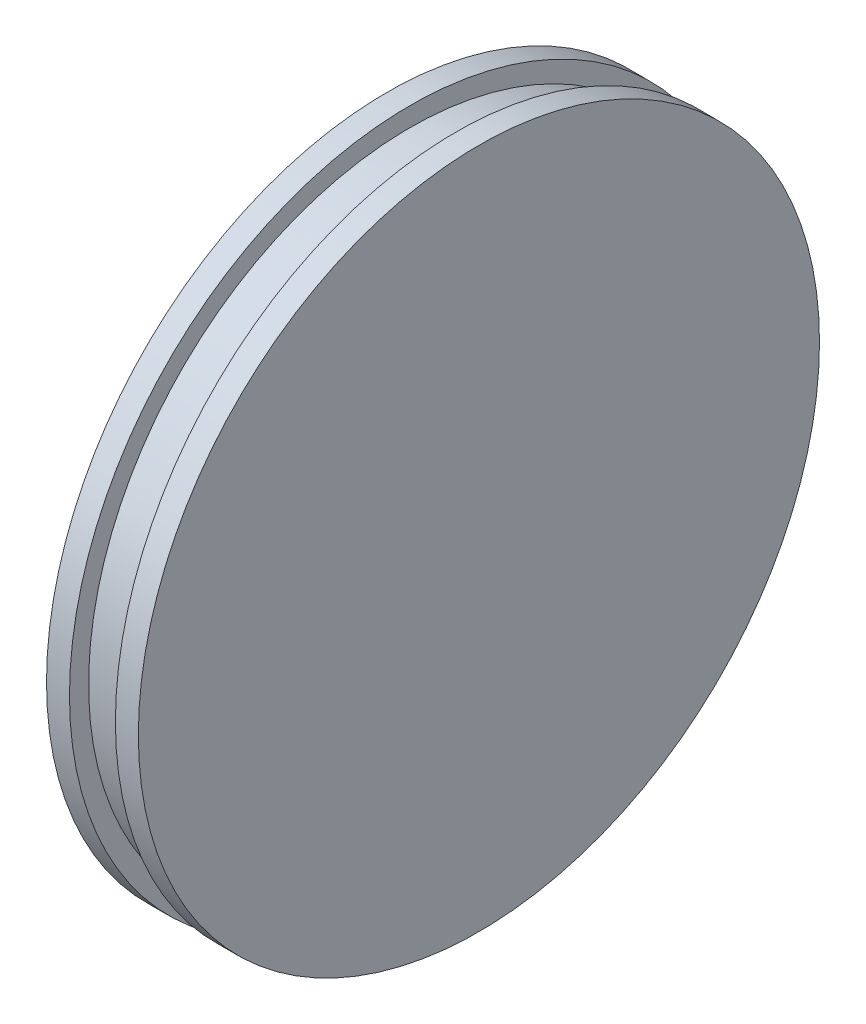
ISO-10303-21;
HEADER;
FILE_DESCRIPTION(('STEP AP214'),'2;1');
FILE_NAME('part.step','',(''),(''),'','','');
FILE_SCHEMA(('AUTOMOTIVE_DESIGN { 1 0 10303 214 1 1 1 1 }'));
ENDSEC;
DATA;
#1=APPLICATION_CONTEXT('core data for automotive mechanical design processes');
#2=APPLICATION_PROTOCOL_DEFINITION('international standard','automotive_design',2000,#1);
#3=PRODUCT_CONTEXT('',#1,'mechanical');
#4=PRODUCT('Part','Part','',(#3));
#5=PRODUCT_RELATED_PRODUCT_CATEGORY('part','',(#4));
#6=PRODUCT_DEFINITION_FORMATION('','',#4);
#7=PRODUCT_DEFINITION_CONTEXT('part definition',#1,'design');
#8=PRODUCT_DEFINITION('design','',#6,#7);
#9=PRODUCT_DEFINITION_SHAPE('','',#8);
#10=(LENGTH_UNIT() NAMED_UNIT(*) SI_UNIT(.MILLI.,.METRE.));
#11=(NAMED_UNIT(*) PLANE_ANGLE_UNIT() SI_UNIT($,.RADIAN.));
#12=(NAMED_UNIT(*) SI_UNIT($,.STERADIAN.) SOLID_ANGLE_UNIT());
#13=UNCERTAINTY_MEASURE_WITH_UNIT(LENGTH_MEASURE(1.E-05),#10,'distance_accuracy_value','');
#14=(GEOMETRIC_REPRESENTATION_CONTEXT(3) GLOBAL_UNCERTAINTY_ASSIGNED_CONTEXT((#13)) GLOBAL_UNIT_ASSIGNED_CONTEXT((#10,
#11,#12)) REPRESENTATION_CONTEXT('',''));
#15=CARTESIAN_POINT('',(0.,0.,0.));
#16=DIRECTION('',(0.,0.,1.));
#17=DIRECTION('',(1.,0.,0.));
#18=AXIS2_PLACEMENT_3D('',#15,#16,#17);
#19=CARTESIAN_POINT('',(12.,0.,0.));
#20=DIRECTION('',(-1.,0.,0.));
#21=DIRECTION('',(0.,0.,1.));
#22=AXIS2_PLACEMENT_3D('',#19,#20,#21);
#23=CYLINDRICAL_SURFACE('',#22,44.5);
#24=CARTESIAN_POINT('',(9.,0.,0.));
#25=DIRECTION('',(1.,0.,0.));
#26=DIRECTION('',(0.,0.,-1.));
#27=AXIS2_PLACEMENT_3D('',#24,#25,#26);
#28=CIRCLE('',#27,44.5);
#29=CARTESIAN_POINT('',(9.,0.,-44.5));
#30=VERTEX_POINT('',#29);
#31=EDGE_CURVE('E53',#30,#30,#28,.T.);
#32=ORIENTED_EDGE('',*,*,#31,.T.);
#33=EDGE_LOOP('',(#32));
#34=FACE_BOUND('',#33,.T.);
#35=CARTESIAN_POINT('',(12.,0.,0.));
#36=DIRECTION('',(1.,0.,0.));
#37=DIRECTION('',(0.,0.,-1.));
#38=AXIS2_PLACEMENT_3D('',#35,#36,#37);
#39=CIRCLE('',#38,44.5);
#40=CARTESIAN_POINT('',(12.,0.,-44.5));
#41=VERTEX_POINT('',#40);
#42=EDGE_CURVE('E10',#41,#41,#39,.T.);
#43=ORIENTED_EDGE('',*,*,#42,.F.);
#44=EDGE_LOOP('',(#43));
#45=FACE_BOUND('',#44,.T.);
#46=ADVANCED_FACE('F41',(#34,#45),#23,.T.);
#47=CARTESIAN_POINT('',(12.,0.,0.));
#48=DIRECTION('',(1.,0.,0.));
#49=DIRECTION('',(0.,0.,-1.));
#50=AXIS2_PLACEMENT_3D('',#47,#48,#49);
#51=PLANE('',#50);
#52=ORIENTED_EDGE('',*,*,#42,.T.);
#53=EDGE_LOOP('',(#52));
#54=FACE_BOUND('',#53,.T.);
#55=ADVANCED_FACE('F113',(#54),#51,.T.);
#56=CARTESIAN_POINT('',(9.,0.,0.));
#57=DIRECTION('',(1.,0.,0.));
#58=DIRECTION('',(0.,0.,-1.));
#59=AXIS2_PLACEMENT_3D('',#56,#57,#58);
#60=PLANE('',#59);
#61=ORIENTED_EDGE('',*,*,#31,.F.);
#62=EDGE_LOOP('',(#61));
#63=FACE_BOUND('',#62,.T.);
#64=CARTESIAN_POINT('',(9.,0.,0.));
#65=DIRECTION('',(1.,0.,0.));
#66=DIRECTION('',(0.,0.,-1.));
#67=AXIS2_PLACEMENT_3D('',#64,#65,#66);
#68=CIRCLE('',#67,42.);
#69=CARTESIAN_POINT('',(9.,0.,-42.));
#70=VERTEX_POINT('',#69);
#71=EDGE_CURVE('E59',#70,#70,#68,.T.);
#72=ORIENTED_EDGE('',*,*,#71,.T.);
#73=EDGE_LOOP('',(#72));
#74=FACE_BOUND('',#73,.T.);
#75=ADVANCED_FACE('F101',(#63,#74),#60,.F.);
#76=CARTESIAN_POINT('',(3.,0.,0.));
#77=DIRECTION('',(1.,0.,0.));
#78=DIRECTION('',(0.,0.,-1.));
#79=AXIS2_PLACEMENT_3D('',#76,#77,#78);
#80=PLANE('',#79);
#81=CARTESIAN_POINT('',(3.,0.,0.));
#82=DIRECTION('',(1.,0.,0.));
#83=DIRECTION('',(0.,0.,-1.));
#84=AXIS2_PLACEMENT_3D('',#81,#82,#83);
#85=CIRCLE('',#84,44.5);
#86=CARTESIAN_POINT('',(3.,0.,-44.5));
#87=VERTEX_POINT('',#86);
#88=EDGE_CURVE('E55',#87,#87,#85,.T.);
#89=ORIENTED_EDGE('',*,*,#88,.T.);
#90=EDGE_LOOP('',(#89));
#91=FACE_BOUND('',#90,.T.);
#92=CARTESIAN_POINT('',(3.,0.,0.));
#93=DIRECTION('',(1.,0.,0.));
#94=DIRECTION('',(0.,0.,-1.));
#95=AXIS2_PLACEMENT_3D('',#92,#93,#94);
#96=CIRCLE('',#95,42.);
#97=CARTESIAN_POINT('',(3.,0.,-42.));
#98=VERTEX_POINT('',#97);
#99=EDGE_CURVE('E63',#98,#98,#96,.T.);
#100=ORIENTED_EDGE('',*,*,#99,.F.);
#101=EDGE_LOOP('',(#100));
#102=FACE_BOUND('',#101,.T.);
#103=ADVANCED_FACE('F98',(#91,#102),#80,.T.);
#104=CARTESIAN_POINT('',(9.,0.,0.));
#105=DIRECTION('',(-1.,0.,0.));
#106=DIRECTION('',(0.,0.,1.));
#107=AXIS2_PLACEMENT_3D('',#104,#105,#106);
#108=CYLINDRICAL_SURFACE('',#107,42.);
#109=ORIENTED_EDGE('',*,*,#71,.F.);
#110=EDGE_LOOP('',(#109));
#111=FACE_BOUND('',#110,.T.);
#112=ORIENTED_EDGE('',*,*,#99,.T.);
#113=EDGE_LOOP('',(#112));
#114=FACE_BOUND('',#113,.T.);
#115=ADVANCED_FACE('F91',(#111,#114),#108,.T.);
#116=CARTESIAN_POINT('',(0.,0.,0.));
#117=DIRECTION('',(1.,0.,0.));
#118=DIRECTION('',(0.,0.,-1.));
#119=AXIS2_PLACEMENT_3D('',#116,#117,#118);
#120=PLANE('',#119);
#121=CARTESIAN_POINT('',(0.,0.,0.));
#122=DIRECTION('',(-1.,0.,0.));
#123=DIRECTION('',(0.,0.,1.));
#124=AXIS2_PLACEMENT_3D('',#121,#122,#123);
#125=CIRCLE('',#124,17.5);
#126=CARTESIAN_POINT('',(0.,0.,17.5));
#127=VERTEX_POINT('',#126);
#128=EDGE_CURVE('E71',#127,#127,#125,.T.);
#129=ORIENTED_EDGE('',*,*,#128,.F.);
#130=EDGE_LOOP('',(#129));
#131=FACE_BOUND('',#130,.T.);
#132=CARTESIAN_POINT('',(0.,0.,0.));
#133=DIRECTION('',(1.,0.,0.));
#134=DIRECTION('',(0.,0.,-1.));
#135=AXIS2_PLACEMENT_3D('',#132,#133,#134);
#136=CIRCLE('',#135,44.5);
#137=CARTESIAN_POINT('',(0.,0.,-44.5));
#138=VERTEX_POINT('',#137);
#139=EDGE_CURVE('E44',#138,#138,#136,.T.);
#140=ORIENTED_EDGE('',*,*,#139,.F.);
#141=EDGE_LOOP('',(#140));
#142=FACE_BOUND('',#141,.T.);
#143=ADVANCED_FACE('F88',(#131,#142),#120,.F.);
#144=ORIENTED_EDGE('',*,*,#139,.T.);
#145=EDGE_LOOP('',(#144));
#146=FACE_BOUND('',#145,.T.);
#147=ORIENTED_EDGE('',*,*,#88,.F.);
#148=EDGE_LOOP('',(#147));
#149=FACE_BOUND('',#148,.T.);
#150=ADVANCED_FACE('F84',(#146,#149),#23,.T.);
#151=CARTESIAN_POINT('',(3.,0.,0.));
#152=DIRECTION('',(-1.,0.,0.));
#153=DIRECTION('',(0.,0.,1.));
#154=AXIS2_PLACEMENT_3D('',#151,#152,#153);
#155=CYLINDRICAL_SURFACE('',#154,17.5);
#156=CARTESIAN_POINT('',(3.,0.,0.));
#157=DIRECTION('',(-1.,0.,0.));
#158=DIRECTION('',(0.,0.,1.));
#159=AXIS2_PLACEMENT_3D('',#156,#157,#158);
#160=CIRCLE('',#159,17.5);
#161=CARTESIAN_POINT('',(3.,0.,17.5));
#162=VERTEX_POINT('',#161);
#163=EDGE_CURVE('E67',#162,#162,#160,.T.);
#164=ORIENTED_EDGE('',*,*,#163,.F.);
#165=EDGE_LOOP('',(#164));
#166=FACE_BOUND('',#165,.T.);
#167=ORIENTED_EDGE('',*,*,#128,.T.);
#168=EDGE_LOOP('',(#167));
#169=FACE_BOUND('',#168,.T.);
#170=ADVANCED_FACE('F81',(#166,#169),#155,.F.);
#171=CARTESIAN_POINT('',(3.,0.,0.));
#172=DIRECTION('',(-1.,0.,0.));
#173=DIRECTION('',(0.,0.,1.));
#174=AXIS2_PLACEMENT_3D('',#171,#172,#173);
#175=PLANE('',#174);
#176=ORIENTED_EDGE('',*,*,#163,.T.);
#177=EDGE_LOOP('',(#176));
#178=FACE_BOUND('',#177,.T.);
#179=ADVANCED_FACE('F79',(#178),#175,.T.);
#180=CLOSED_SHELL('',(#46,#55,#75,#103,#115,#143,#150,#170,#179));
#181=MANIFOLD_SOLID_BREP('B2',#180);
#182=ADVANCED_BREP_SHAPE_REPRESENTATION('',(#18,#181),#14);
#183=SHAPE_DEFINITION_REPRESENTATION(#9,#182);
ENDSEC;
END-ISO-10303-21;
